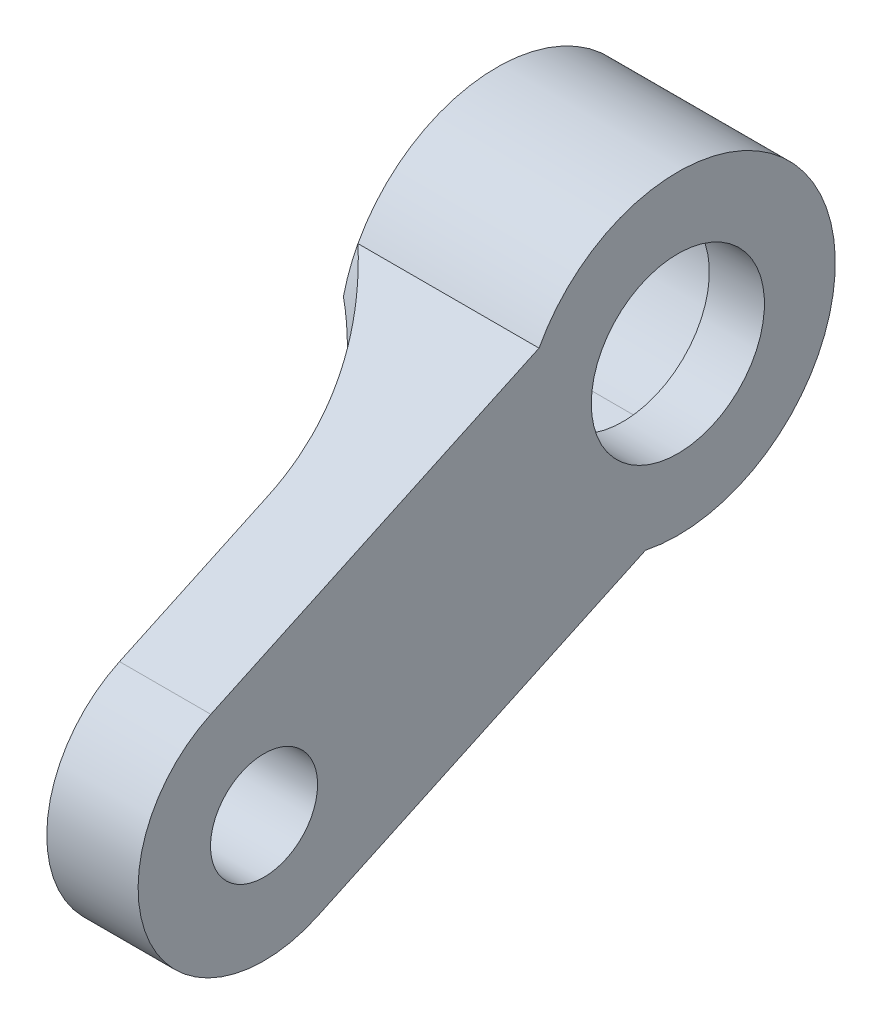
ISO-10303-21;
HEADER;
FILE_DESCRIPTION(('STEP AP214'),'2;1');
FILE_NAME('part.step','',(''),(''),'','','');
FILE_SCHEMA(('AUTOMOTIVE_DESIGN { 1 0 10303 214 1 1 1 1 }'));
ENDSEC;
DATA;
#1=APPLICATION_CONTEXT('core data for automotive mechanical design processes');
#2=APPLICATION_PROTOCOL_DEFINITION('international standard','automotive_design',2000,#1);
#3=PRODUCT_CONTEXT('',#1,'mechanical');
#4=PRODUCT('Part','Part','',(#3));
#5=PRODUCT_RELATED_PRODUCT_CATEGORY('part','',(#4));
#6=PRODUCT_DEFINITION_FORMATION('','',#4);
#7=PRODUCT_DEFINITION_CONTEXT('part definition',#1,'design');
#8=PRODUCT_DEFINITION('design','',#6,#7);
#9=PRODUCT_DEFINITION_SHAPE('','',#8);
#10=(LENGTH_UNIT() NAMED_UNIT(*) SI_UNIT(.MILLI.,.METRE.));
#11=(NAMED_UNIT(*) PLANE_ANGLE_UNIT() SI_UNIT($,.RADIAN.));
#12=(NAMED_UNIT(*) SI_UNIT($,.STERADIAN.) SOLID_ANGLE_UNIT());
#13=UNCERTAINTY_MEASURE_WITH_UNIT(LENGTH_MEASURE(1.E-05),#10,'distance_accuracy_value','');
#14=(GEOMETRIC_REPRESENTATION_CONTEXT(3) GLOBAL_UNCERTAINTY_ASSIGNED_CONTEXT((#13)) GLOBAL_UNIT_ASSIGNED_CONTEXT((#10,
#11,#12)) REPRESENTATION_CONTEXT('',''));
#15=CARTESIAN_POINT('',(0.,0.,0.));
#16=DIRECTION('',(0.,0.,1.));
#17=DIRECTION('',(1.,0.,0.));
#18=AXIS2_PLACEMENT_3D('',#15,#16,#17);
#19=CARTESIAN_POINT('',(41.15,-19.3632656734985,-42.4024999550802));
#20=DIRECTION('',(-1.,0.,0.));
#21=DIRECTION('',(0.,0.,1.));
#22=AXIS2_PLACEMENT_3D('',#19,#20,#21);
#23=CYLINDRICAL_SURFACE('',#22,2.75000000000001);
#24=CARTESIAN_POINT('',(46.9,-19.3632656734985,-42.4024999550802));
#25=DIRECTION('',(-1.,0.,0.));
#26=DIRECTION('',(0.,0.,1.));
#27=AXIS2_PLACEMENT_3D('',#24,#25,#26);
#28=CIRCLE('',#27,2.75000000000001);
#29=CARTESIAN_POINT('',(46.9,-19.3632656734985,-39.6524999550802));
#30=VERTEX_POINT('',#29);
#31=EDGE_CURVE('E175',#30,#30,#28,.T.);
#32=ORIENTED_EDGE('',*,*,#31,.F.);
#33=EDGE_LOOP('',(#32));
#34=FACE_BOUND('',#33,.T.);
#35=CARTESIAN_POINT('',(45.15,-19.3632656734985,-42.4024999550802));
#36=DIRECTION('',(-1.,0.,0.));
#37=DIRECTION('',(0.,0.,1.));
#38=AXIS2_PLACEMENT_3D('',#35,#36,#37);
#39=CIRCLE('',#38,2.75000000000001);
#40=CARTESIAN_POINT('',(45.15,-19.3632656734985,-39.6524999550802));
#41=VERTEX_POINT('',#40);
#42=EDGE_CURVE('E50',#41,#41,#39,.F.);
#43=ORIENTED_EDGE('',*,*,#42,.F.);
#44=EDGE_LOOP('',(#43));
#45=FACE_BOUND('',#44,.T.);
#46=ADVANCED_FACE('F45',(#34,#45),#23,.F.);
#47=CARTESIAN_POINT('',(44.,-19.3632656734985,-42.4024999550802));
#48=DIRECTION('',(-1.,0.,0.));
#49=DIRECTION('',(0.,0.,1.));
#50=AXIS2_PLACEMENT_3D('',#47,#48,#49);
#51=CYLINDRICAL_SURFACE('',#50,5.);
#52=CARTESIAN_POINT('',(41.15,-19.3632656734985,-42.4024999550802));
#53=DIRECTION('',(-1.,0.,0.));
#54=DIRECTION('',(0.,0.,1.));
#55=AXIS2_PLACEMENT_3D('',#52,#53,#54);
#56=CIRCLE('',#55,5.);
#57=CARTESIAN_POINT('',(41.15,-17.005889310574,-37.9931035470075));
#58=VERTEX_POINT('',#57);
#59=CARTESIAN_POINT('',(41.15,-24.2563516068672,-41.3740496409331));
#60=VERTEX_POINT('',#59);
#61=EDGE_CURVE('E228',#58,#60,#56,.T.);
#62=ORIENTED_EDGE('',*,*,#61,.F.);
#63=DIRECTION('',(-1.,0.,0.));
#64=VECTOR('',#63,1.);
#65=CARTESIAN_POINT('',(61.0421356237309,-17.005889310574,-37.9931035470075));
#66=LINE('',#65,#64);
#67=CARTESIAN_POINT('',(46.9,-17.005889310574,-37.9931035470075));
#68=VERTEX_POINT('',#67);
#69=EDGE_CURVE('E190',#68,#58,#66,.T.);
#70=ORIENTED_EDGE('',*,*,#69,.F.);
#71=CARTESIAN_POINT('',(46.9,-19.3632656734985,-42.4024999550802));
#72=DIRECTION('',(-1.,0.,0.));
#73=DIRECTION('',(0.,0.,1.));
#74=AXIS2_PLACEMENT_3D('',#71,#72,#73);
#75=CIRCLE('',#74,5.);
#76=CARTESIAN_POINT('',(46.9,-24.2563516068672,-41.3740496409331));
#77=VERTEX_POINT('',#76);
#78=EDGE_CURVE('E187',#77,#68,#75,.F.);
#79=ORIENTED_EDGE('',*,*,#78,.F.);
#80=DIRECTION('',(-1.,0.,0.));
#81=VECTOR('',#80,1.);
#82=CARTESIAN_POINT('',(61.0421356237309,-24.2563516068672,-41.3740496409331));
#83=LINE('',#82,#81);
#84=EDGE_CURVE('E193',#60,#77,#83,.F.);
#85=ORIENTED_EDGE('',*,*,#84,.F.);
#86=EDGE_LOOP('',(#62,#70,#79,#85));
#87=FACE_BOUND('',#86,.T.);
#88=ADVANCED_FACE('F268',(#87),#51,.T.);
#89=CARTESIAN_POINT('',(41.15,-19.3632656734985,-42.4024999550802));
#90=DIRECTION('',(-1.,0.,0.));
#91=DIRECTION('',(0.,0.,1.));
#92=AXIS2_PLACEMENT_3D('',#89,#90,#91);
#93=PLANE('',#92);
#94=DIRECTION('',(0.,0.544502263470201,-0.838759372571077));
#95=VECTOR('',#94,1.);
#96=CARTESIAN_POINT('',(41.15,-16.3437319322427,-40.4422918065875));
#97=LINE('',#96,#95);
#98=CARTESIAN_POINT('',(41.15,-18.2330841724793,-37.5319055586278));
#99=VERTEX_POINT('',#98);
#100=CARTESIAN_POINT('',(41.15,-16.3437319322427,-40.4422918065875));
#101=VERTEX_POINT('',#100);
#102=EDGE_CURVE('E153',#99,#101,#97,.T.);
#103=ORIENTED_EDGE('',*,*,#102,.F.);
#104=EDGE_CURVE('E227',#99,#58,#56,.T.);
#105=ORIENTED_EDGE('',*,*,#104,.T.);
#106=ORIENTED_EDGE('',*,*,#61,.T.);
#107=CARTESIAN_POINT('',(41.15,-23.8208241111395,-40.1375114838036));
#108=VERTEX_POINT('',#107);
#109=EDGE_CURVE('E233',#60,#108,#56,.T.);
#110=ORIENTED_EDGE('',*,*,#109,.T.);
#111=DIRECTION('',(0.,-0.29252764806711,0.956257065394199));
#112=VECTOR('',#111,1.);
#113=CARTESIAN_POINT('',(41.15,-25.2574450657046,-35.4412752573354));
#114=LINE('',#113,#112);
#115=CARTESIAN_POINT('',(41.15,-22.8057911089176,-43.4555994881218));
#116=VERTEX_POINT('',#115);
#117=EDGE_CURVE('E63',#116,#108,#114,.T.);
#118=ORIENTED_EDGE('',*,*,#117,.F.);
#119=CARTESIAN_POINT('',(41.15,-19.3632656734985,-42.4024999550802));
#120=DIRECTION('',(-1.,0.,0.));
#121=DIRECTION('',(0.,0.,1.));
#122=AXIS2_PLACEMENT_3D('',#119,#120,#121);
#123=CIRCLE('',#122,3.59999999999999);
#124=EDGE_CURVE('E134',#101,#116,#123,.T.);
#125=ORIENTED_EDGE('',*,*,#124,.F.);
#126=EDGE_LOOP('',(#103,#105,#106,#110,#118,#125));
#127=FACE_BOUND('',#126,.T.);
#128=ADVANCED_FACE('F266',(#127),#93,.T.);
#129=CARTESIAN_POINT('',(44.,-25.4912304687386,-29.2610370430488));
#130=DIRECTION('',(-1.,0.,0.));
#131=DIRECTION('',(0.,0.,1.));
#132=AXIS2_PLACEMENT_3D('',#129,#130,#131);
#133=PLANE('',#132);
#134=CARTESIAN_POINT('',(44.,-25.4912304687386,-29.2610370430488));
#135=DIRECTION('',(-1.,0.,0.));
#136=DIRECTION('',(0.,0.,1.));
#137=AXIS2_PLACEMENT_3D('',#134,#135,#136);
#138=CIRCLE('',#137,1.70000000000001);
#139=CARTESIAN_POINT('',(44.,-25.4912304687386,-27.5610370430488));
#140=VERTEX_POINT('',#139);
#141=EDGE_CURVE('E183',#140,#140,#138,.T.);
#142=ORIENTED_EDGE('',*,*,#141,.F.);
#143=EDGE_LOOP('',(#142));
#144=FACE_BOUND('',#143,.T.);
#145=DIRECTION('',(0.,-0.422618261740703,0.906307787036648));
#146=VECTOR('',#145,1.);
#147=CARTESIAN_POINT('',(44.,-21.8659993205921,-27.570563996086));
#148=LINE('',#147,#146);
#149=CARTESIAN_POINT('',(44.,-19.6605065307051,-32.3002585471325));
#150=VERTEX_POINT('',#149);
#151=CARTESIAN_POINT('',(44.,-21.8659993205921,-27.570563996086));
#152=VERTEX_POINT('',#151);
#153=EDGE_CURVE('E203',#150,#152,#148,.T.);
#154=ORIENTED_EDGE('',*,*,#153,.F.);
#155=CARTESIAN_POINT('',(44.,-19.3632656734985,-42.4024999550802));
#156=DIRECTION('',(-1.,0.,0.));
#157=DIRECTION('',(0.,0.,1.));
#158=AXIS2_PLACEMENT_3D('',#155,#156,#157);
#159=CIRCLE('',#158,10.1066133591648);
#160=CARTESIAN_POINT('',(44.,-26.9109688269983,-35.681204641058));
#161=VERTEX_POINT('',#160);
#162=EDGE_CURVE('E232',#150,#161,#159,.F.);
#163=ORIENTED_EDGE('',*,*,#162,.T.);
#164=DIRECTION('',(0.,0.422618261740692,-0.906307787036653));
#165=VECTOR('',#164,1.);
#166=CARTESIAN_POINT('',(44.,-22.9884968216452,-44.092973002043));
#167=LINE('',#166,#165);
#168=CARTESIAN_POINT('',(44.,-29.1164616168852,-30.9515100900116));
#169=VERTEX_POINT('',#168);
#170=EDGE_CURVE('E214',#169,#161,#167,.T.);
#171=ORIENTED_EDGE('',*,*,#170,.F.);
#172=CARTESIAN_POINT('',(44.,-25.4912304687386,-29.2610370430488));
#173=DIRECTION('',(1.,0.,0.));
#174=DIRECTION('',(0.,0.,1.));
#175=AXIS2_PLACEMENT_3D('',#172,#173,#174);
#176=CIRCLE('',#175,3.99999999999996);
#177=EDGE_CURVE('E197',#152,#169,#176,.T.);
#178=ORIENTED_EDGE('',*,*,#177,.F.);
#179=EDGE_LOOP('',(#154,#163,#171,#178));
#180=FACE_BOUND('',#179,.T.);
#181=ADVANCED_FACE('F256',(#144,#180),#133,.T.);
#182=CARTESIAN_POINT('',(46.9,-25.4912304687386,-29.2610370430488));
#183=DIRECTION('',(-1.,0.,0.));
#184=DIRECTION('',(0.,0.,1.));
#185=AXIS2_PLACEMENT_3D('',#182,#183,#184);
#186=CYLINDRICAL_SURFACE('',#185,3.99999999999996);
#187=ORIENTED_EDGE('',*,*,#177,.T.);
#188=DIRECTION('',(-1.,0.,0.));
#189=VECTOR('',#188,1.);
#190=CARTESIAN_POINT('',(46.9,-29.1164616168852,-30.9515100900116));
#191=LINE('',#190,#189);
#192=CARTESIAN_POINT('',(46.9,-29.1164616168852,-30.9515100900116));
#193=VERTEX_POINT('',#192);
#194=EDGE_CURVE('E223',#193,#169,#191,.T.);
#195=ORIENTED_EDGE('',*,*,#194,.F.);
#196=CARTESIAN_POINT('',(46.9,-25.4912304687386,-29.2610370430488));
#197=DIRECTION('',(1.,0.,0.));
#198=DIRECTION('',(0.,0.,1.));
#199=AXIS2_PLACEMENT_3D('',#196,#197,#198);
#200=CIRCLE('',#199,3.99999999999996);
#201=CARTESIAN_POINT('',(46.9,-21.8659993205921,-27.570563996086));
#202=VERTEX_POINT('',#201);
#203=EDGE_CURVE('E198',#202,#193,#200,.T.);
#204=ORIENTED_EDGE('',*,*,#203,.F.);
#205=DIRECTION('',(-1.,0.,0.));
#206=VECTOR('',#205,1.);
#207=CARTESIAN_POINT('',(46.9,-21.8659993205921,-27.570563996086));
#208=LINE('',#207,#206);
#209=EDGE_CURVE('E210',#202,#152,#208,.T.);
#210=ORIENTED_EDGE('',*,*,#209,.T.);
#211=EDGE_LOOP('',(#187,#195,#204,#210));
#212=FACE_BOUND('',#211,.T.);
#213=ADVANCED_FACE('F261',(#212),#186,.T.);
#214=CARTESIAN_POINT('',(46.9,-22.9884968216452,-44.092973002043));
#215=DIRECTION('',(0.,0.906307787036653,0.422618261740692));
#216=DIRECTION('',(0.,-0.422618261740692,0.906307787036653));
#217=AXIS2_PLACEMENT_3D('',#214,#215,#216);
#218=PLANE('',#217);
#219=ORIENTED_EDGE('',*,*,#170,.T.);
#220=CARTESIAN_POINT('',(44.,-26.9109688269983,-35.681204641058));
#221=CARTESIAN_POINT('',(44.0000327295333,-26.8197614564599,-35.8767994783791));
#222=CARTESIAN_POINT('',(43.9901832031741,-26.7285848499537,-36.0723283420203));
#223=CARTESIAN_POINT('',(43.9516322511718,-26.5470314890996,-36.4616707808138));
#224=CARTESIAN_POINT('',(43.9229492677209,-26.4566540398497,-36.6554858461881));
#225=CARTESIAN_POINT('',(43.8479501167086,-26.2779938184975,-37.0386239272976));
#226=CARTESIAN_POINT('',(43.8017808468564,-26.1896999343085,-37.2279707729796));
#227=CARTESIAN_POINT('',(43.6928417332647,-26.0149440385046,-37.6027360009309));
#228=CARTESIAN_POINT('',(43.6300668020894,-25.9284825970739,-37.7881531604364));
#229=CARTESIAN_POINT('',(43.4726881628036,-25.7380286945601,-38.1965828724152));
#230=CARTESIAN_POINT('',(43.3740786102851,-25.6346258097312,-38.4183310745315));
#231=CARTESIAN_POINT('',(43.1556871669465,-25.4318964419442,-38.8530856067413));
#232=CARTESIAN_POINT('',(43.035900404997,-25.3325709033379,-39.0660899116657));
#233=CARTESIAN_POINT('',(42.7771330317672,-25.1381100186839,-39.4831126245748));
#234=CARTESIAN_POINT('',(42.6380945934448,-25.042988480697,-39.6871014210771));
#235=CARTESIAN_POINT('',(42.3434140225703,-24.8574498923156,-40.0849902078826));
#236=CARTESIAN_POINT('',(42.1877688543027,-24.7670337065706,-40.278888343939));
#237=CARTESIAN_POINT('',(41.8881075874565,-24.6050274297746,-40.626311925694));
#238=CARTESIAN_POINT('',(41.746199499198,-24.5327356290325,-40.7813421926814));
#239=CARTESIAN_POINT('',(41.454138478049,-24.3918790803988,-41.0834100360255));
#240=CARTESIAN_POINT('',(41.3040345001586,-24.3232962257215,-41.2304864425093));
#241=CARTESIAN_POINT('',(41.15,-24.2563516068672,-41.3740496409331));
#242=B_SPLINE_CURVE_WITH_KNOTS('',3,(#220,#221,#222,#223,#224,#225,#226,#227,#228,#229,#230,
#231,#232,#233,#234,#235,#236,#237,#238,#239,#240,#241),.UNSPECIFIED.,.F.,.F.,(4,2,2,2,2,2,2,2,
2,2,4),(0.,0.647112947909194,1.29359316975926,1.93475879312719,2.57612107679734,
3.36636659999365,4.15679413057498,4.94964959702112,5.74265024681657,6.4091006805164,
7.07193219657398),.UNSPECIFIED.);
#243=EDGE_CURVE('E243',#161,#60,#242,.T.);
#244=ORIENTED_EDGE('',*,*,#243,.T.);
#245=ORIENTED_EDGE('',*,*,#84,.T.);
#246=DIRECTION('',(0.,0.422618261740692,-0.906307787036653));
#247=VECTOR('',#246,1.);
#248=CARTESIAN_POINT('',(46.9,-22.9884968216452,-44.092973002043));
#249=LINE('',#248,#247);
#250=EDGE_CURVE('E202',#193,#77,#249,.T.);
#251=ORIENTED_EDGE('',*,*,#250,.F.);
#252=ORIENTED_EDGE('',*,*,#194,.T.);
#253=EDGE_LOOP('',(#219,#244,#245,#251,#252));
#254=FACE_BOUND('',#253,.T.);
#255=ADVANCED_FACE('F255',(#254),#218,.F.);
#256=CARTESIAN_POINT('',(46.9,-21.8659993205921,-27.570563996086));
#257=DIRECTION('',(0.,-0.906307787036648,-0.422618261740703));
#258=DIRECTION('',(0.,0.422618261740703,-0.906307787036648));
#259=AXIS2_PLACEMENT_3D('',#256,#257,#258);
#260=PLANE('',#259);
#261=DIRECTION('',(0.,-0.422618261740703,0.906307787036648));
#262=VECTOR('',#261,1.);
#263=CARTESIAN_POINT('',(46.9,-21.8659993205921,-27.570563996086));
#264=LINE('',#263,#262);
#265=EDGE_CURVE('E207',#68,#202,#264,.T.);
#266=ORIENTED_EDGE('',*,*,#265,.F.);
#267=ORIENTED_EDGE('',*,*,#69,.T.);
#268=CARTESIAN_POINT('',(41.15,-17.005889310574,-37.9931035470075));
#269=CARTESIAN_POINT('',(41.3418738388692,-17.089288889543,-37.814252572741));
#270=CARTESIAN_POINT('',(41.5277079199327,-17.1752454595924,-37.6299181134067));
#271=CARTESIAN_POINT('',(41.8853864283286,-17.3524537915975,-37.2498936190498));
#272=CARTESIAN_POINT('',(42.0572062740653,-17.4437143966062,-37.0541846200388));
#273=CARTESIAN_POINT('',(42.3859658197307,-17.6323980164965,-36.6495512913972));
#274=CARTESIAN_POINT('',(42.5427329207076,-17.7298750788148,-36.4405110566647));
#275=CARTESIAN_POINT('',(42.8365631154949,-17.929936880589,-36.0114771382302));
#276=CARTESIAN_POINT('',(42.973639827842,-18.0325180231324,-35.7914911681322));
#277=CARTESIAN_POINT('',(43.2014188319922,-18.2224584780283,-35.3841625481232));
#278=CARTESIAN_POINT('',(43.2959802338015,-18.3089921319281,-35.1985905284781));
#279=CARTESIAN_POINT('',(43.4689778739043,-18.4848861052588,-34.8213846853945));
#280=CARTESIAN_POINT('',(43.5474176089507,-18.5742458068643,-34.6297521868868));
#281=CARTESIAN_POINT('',(43.6864004185754,-18.7548967517852,-34.2423449853074));
#282=CARTESIAN_POINT('',(43.7470370306641,-18.8461750976408,-34.0465979409273));
#283=CARTESIAN_POINT('',(43.8496522841153,-19.0305521984741,-33.6511999722068));
#284=CARTESIAN_POINT('',(43.8916407858761,-19.1236499641592,-33.4515511694111));
#285=CARTESIAN_POINT('',(43.9488492945265,-19.2906346296926,-33.093451398556));
#286=CARTESIAN_POINT('',(43.9679078503326,-19.3642889578016,-32.9354991822006));
#287=CARTESIAN_POINT('',(43.9935013448059,-19.512124120854,-32.6184656519401));
#288=CARTESIAN_POINT('',(44.0000123974606,-19.5863056907054,-32.4593827620196));
#289=CARTESIAN_POINT('',(44.,-19.6605065307051,-32.3002585471325));
#290=B_SPLINE_CURVE_WITH_KNOTS('',3,(#268,#269,#270,#271,#272,#273,#274,#275,#276,#277,#278,
#279,#280,#281,#282,#283,#284,#285,#286,#287,#288,#289),.UNSPECIFIED.,.F.,.F.,(4,2,2,2,2,2,2,2,
2,2,4),(0.,0.825787813876534,1.65299426781315,2.48877054858107,3.32396596593583,3.9999614355401,
4.67581012817157,5.34804162297307,6.01991724337438,6.54544467643874,7.07197154363121),.UNSPECIFIED.);
#291=EDGE_CURVE('E71',#58,#150,#290,.T.);
#292=ORIENTED_EDGE('',*,*,#291,.T.);
#293=ORIENTED_EDGE('',*,*,#153,.T.);
#294=ORIENTED_EDGE('',*,*,#209,.F.);
#295=EDGE_LOOP('',(#266,#267,#292,#293,#294));
#296=FACE_BOUND('',#295,.T.);
#297=ADVANCED_FACE('F250',(#296),#260,.F.);
#298=CARTESIAN_POINT('',(46.9,-25.4912304687386,-29.2610370430488));
#299=DIRECTION('',(-1.,0.,0.));
#300=DIRECTION('',(0.,0.,1.));
#301=AXIS2_PLACEMENT_3D('',#298,#299,#300);
#302=PLANE('',#301);
#303=ORIENTED_EDGE('',*,*,#31,.T.);
#304=EDGE_LOOP('',(#303));
#305=FACE_BOUND('',#304,.T.);
#306=CARTESIAN_POINT('',(46.9,-25.4912304687386,-29.2610370430488));
#307=DIRECTION('',(1.,0.,0.));
#308=DIRECTION('',(0.,0.,-1.));
#309=AXIS2_PLACEMENT_3D('',#306,#307,#308);
#310=CIRCLE('',#309,1.70000000000001);
#311=CARTESIAN_POINT('',(46.9,-25.4912304687386,-30.9610370430488));
#312=VERTEX_POINT('',#311);
#313=EDGE_CURVE('E179',#312,#312,#310,.T.);
#314=ORIENTED_EDGE('',*,*,#313,.F.);
#315=EDGE_LOOP('',(#314));
#316=FACE_BOUND('',#315,.T.);
#317=ORIENTED_EDGE('',*,*,#250,.T.);
#318=ORIENTED_EDGE('',*,*,#78,.T.);
#319=ORIENTED_EDGE('',*,*,#265,.T.);
#320=ORIENTED_EDGE('',*,*,#203,.T.);
#321=EDGE_LOOP('',(#317,#318,#319,#320));
#322=FACE_BOUND('',#321,.T.);
#323=ADVANCED_FACE('F254',(#305,#316,#322),#302,.F.);
#324=CARTESIAN_POINT('',(46.9,-25.4912304687386,-29.2610370430488));
#325=DIRECTION('',(1.,0.,0.));
#326=DIRECTION('',(0.,0.,-1.));
#327=AXIS2_PLACEMENT_3D('',#324,#325,#326);
#328=CYLINDRICAL_SURFACE('',#327,1.70000000000001);
#329=ORIENTED_EDGE('',*,*,#141,.T.);
#330=EDGE_LOOP('',(#329));
#331=FACE_BOUND('',#330,.T.);
#332=ORIENTED_EDGE('',*,*,#313,.T.);
#333=EDGE_LOOP('',(#332));
#334=FACE_BOUND('',#333,.T.);
#335=ADVANCED_FACE('F306',(#331,#334),#328,.F.);
#336=CARTESIAN_POINT('',(38.,-19.3632656734985,-42.4024999550802));
#337=DIRECTION('',(-1.,0.,0.));
#338=DIRECTION('',(0.,0.,1.));
#339=AXIS2_PLACEMENT_3D('',#336,#337,#338);
#340=TOROIDAL_SURFACE('',#339,10.1066133591648,6.);
#341=ORIENTED_EDGE('',*,*,#104,.F.);
#342=CARTESIAN_POINT('',(41.1498,-18.2329873779623,-37.5320546623391));
#343=CARTESIAN_POINT('',(41.2464839261362,-18.2797891256925,-37.4599605551242));
#344=CARTESIAN_POINT('',(41.3412934103873,-18.3277349379726,-37.386104113887));
#345=CARTESIAN_POINT('',(41.5270475735878,-18.4257984248656,-37.235045662423));
#346=CARTESIAN_POINT('',(41.6179922157307,-18.4759161201531,-37.1578436203486));
#347=CARTESIAN_POINT('',(41.7959528293461,-18.5782372022139,-37.0002267060622));
#348=CARTESIAN_POINT('',(41.8829663868282,-18.63044183442,-36.9198099153671));
#349=CARTESIAN_POINT('',(42.0528293737482,-18.7368160877908,-36.7559494358047));
#350=CARTESIAN_POINT('',(42.1356788233212,-18.790985699452,-36.6725057615768));
#351=CARTESIAN_POINT('',(42.3727555081741,-18.952952203944,-36.4230101528359));
#352=CARTESIAN_POINT('',(42.5210114887081,-19.0633741024345,-36.2529146206233));
#353=CARTESIAN_POINT('',(42.7994720756425,-19.2907345128554,-35.9026852680825));
#354=CARTESIAN_POINT('',(42.9296810908752,-19.407671423362,-35.7225539146115));
#355=CARTESIAN_POINT('',(43.1560742280765,-19.633301550723,-35.3749899157912));
#356=CARTESIAN_POINT('',(43.2544602104874,-19.7413395675751,-35.2085665502551));
#357=CARTESIAN_POINT('',(43.4345128932482,-19.9614497545666,-34.8695055495517));
#358=CARTESIAN_POINT('',(43.5161837728982,-20.0735209080349,-34.6968694804796));
#359=CARTESIAN_POINT('',(43.6635798850373,-20.3042111840536,-34.3415107535231));
#360=CARTESIAN_POINT('',(43.7288048453555,-20.4229256220054,-34.1586412703789));
#361=CARTESIAN_POINT('',(43.8391387091365,-20.6632121511778,-33.788500332559));
#362=CARTESIAN_POINT('',(43.8842277019096,-20.7847869462955,-33.6012247127601));
#363=CARTESIAN_POINT('',(43.9185972147815,-20.9072975230833,-33.4125076009798));
#364=B_SPLINE_CURVE_WITH_KNOTS('',3,(#342,#343,#344,#345,#346,#347,#348,#349,#350,#351,#352,
#353,#354,#355,#356,#357,#358,#359,#360,#361,#362,#363),.UNSPECIFIED.,.F.,.F.,(4,2,2,2,2,2,2,2,
2,2,4),(0.,0.388061692675894,0.776127080202238,1.16442761786467,1.55272627777069,
2.30538313734996,3.05785579926119,3.72154732916275,4.38507271207976,5.06684514922705,
5.74929024661289),.UNSPECIFIED.);
#365=CARTESIAN_POINT('',(43.9185607488582,-20.9071676879287,-33.41270760098));
#366=VERTEX_POINT('',#365);
#367=EDGE_CURVE('E11',#99,#366,#364,.T.);
#368=ORIENTED_EDGE('',*,*,#367,.T.);
#369=CARTESIAN_POINT('',(43.918570414306,-20.9069676879287,-33.4126143394484));
#370=CARTESIAN_POINT('',(43.9097724481628,-21.0881944695322,-33.4971217755729));
#371=CARTESIAN_POINT('',(43.9013469077062,-21.2694423879283,-33.5816390679456));
#372=CARTESIAN_POINT('',(43.8860730126615,-21.6320115606428,-33.7507078497933));
#373=CARTESIAN_POINT('',(43.8792248297953,-21.8133328207952,-33.8352593419887));
#374=CARTESIAN_POINT('',(43.867944185883,-22.1759141771946,-34.004333805182));
#375=CARTESIAN_POINT('',(43.863510048081,-22.3571742282776,-34.0888567551196));
#376=CARTESIAN_POINT('',(43.8575391233077,-22.7197249799696,-34.2579169471034));
#377=CARTESIAN_POINT('',(43.8560021797865,-22.9010156783931,-34.3424541881305));
#378=CARTESIAN_POINT('',(43.8560021797865,-23.2635970752402,-34.5115286701849));
#379=CARTESIAN_POINT('',(43.8575391233077,-23.4448877736637,-34.596065911212));
#380=CARTESIAN_POINT('',(43.863510048081,-23.8074385253557,-34.7651261031958));
#381=CARTESIAN_POINT('',(43.867944185883,-23.9886985764387,-34.8496490531334));
#382=CARTESIAN_POINT('',(43.8792248297953,-24.3512799328382,-35.0187235163267));
#383=CARTESIAN_POINT('',(43.8860730126615,-24.5326011929906,-35.1032750085221));
#384=CARTESIAN_POINT('',(43.9013469077062,-24.8951703657051,-35.2723437903698));
#385=CARTESIAN_POINT('',(43.9097724481628,-25.0764182841011,-35.3568610827425));
#386=CARTESIAN_POINT('',(43.918570414306,-25.2576450657046,-35.441368518867));
#387=B_SPLINE_CURVE_WITH_KNOTS('',3,(#369,#370,#371,#372,#373,#374,#375,#376,#377,#378,#379,
#380,#381,#382,#383,#384,#385,#386),.UNSPECIFIED.,.F.,.F.,(4,2,2,2,2,2,2,2,4),(0.,
0.600475937890758,1.20101721684903,1.8011408358355,2.40123202619402,3.00132321655254,
3.60144683553901,4.20198811449728,4.80246405238803),.UNSPECIFIED.);
#388=CARTESIAN_POINT('',(43.9185607488582,-25.2574450657046,-35.4412752573354));
#389=VERTEX_POINT('',#388);
#390=EDGE_CURVE('E56',#366,#389,#387,.T.);
#391=ORIENTED_EDGE('',*,*,#390,.T.);
#392=CARTESIAN_POINT('',(43.9185927345629,-25.2575062475058,-35.4410752573354));
#393=CARTESIAN_POINT('',(43.8891724476792,-25.2011888898709,-35.6251736545244));
#394=CARTESIAN_POINT('',(43.8519133303101,-25.1452349423301,-35.8080840837646));
#395=CARTESIAN_POINT('',(43.7624951171737,-25.034387499092,-36.1704383825045));
#396=CARTESIAN_POINT('',(43.710344652259,-24.9794934087324,-36.3498841959226));
#397=CARTESIAN_POINT('',(43.5920220153075,-24.8711583207931,-36.7040257410264));
#398=CARTESIAN_POINT('',(43.5258824025109,-24.8177142686751,-36.8787314578324));
#399=CARTESIAN_POINT('',(43.3803308596362,-24.7123904528918,-37.2230293170691));
#400=CARTESIAN_POINT('',(43.3009168251118,-24.6605109388007,-37.3926206436554));
#401=CARTESIAN_POINT('',(43.1208821241408,-24.5533003013696,-37.7430864208438));
#402=CARTESIAN_POINT('',(43.0189212569164,-24.498161713247,-37.9233314842299));
#403=CARTESIAN_POINT('',(42.8010577787471,-24.3902922792557,-38.2759508317544));
#404=CARTESIAN_POINT('',(42.6851535604711,-24.3375617119418,-38.4483242053117));
#405=CARTESIAN_POINT('',(42.4405127619536,-24.2347095008144,-38.784542522561));
#406=CARTESIAN_POINT('',(42.3117748149713,-24.1845881357374,-38.948386555078));
#407=CARTESIAN_POINT('',(42.0425196971629,-24.0871569637267,-39.2668837885552));
#408=CARTESIAN_POINT('',(41.9020065948156,-24.0398461952692,-39.421540132684));
#409=CARTESIAN_POINT('',(41.6595540636445,-23.9637684494629,-39.6702341704177));
#410=CARTESIAN_POINT('',(41.5606984801735,-23.9341550917375,-39.7670386357121));
#411=CARTESIAN_POINT('',(41.3585671851352,-23.8763775961905,-39.9559101447904));
#412=CARTESIAN_POINT('',(41.2553013012198,-23.8482105156481,-40.0479868081697));
#413=CARTESIAN_POINT('',(41.1498,-23.8207721093861,-40.1376814747236));
#414=B_SPLINE_CURVE_WITH_KNOTS('',3,(#392,#393,#394,#395,#396,#397,#398,#399,#400,#401,#402,
#403,#404,#405,#406,#407,#408,#409,#410,#411,#412,#413),.UNSPECIFIED.,.F.,.F.,(4,2,2,2,2,2,2,2,
2,2,4),(0.,0.584039906762632,1.1677419954602,1.750100200819,2.33255081742852,2.97480514033486,
3.61713357070082,4.25953047970073,4.90170633967792,5.32604404084718,5.74948103395814),.UNSPECIFIED.);
#415=EDGE_CURVE('E289',#389,#108,#414,.T.);
#416=ORIENTED_EDGE('',*,*,#415,.T.);
#417=ORIENTED_EDGE('',*,*,#109,.F.);
#418=ORIENTED_EDGE('',*,*,#243,.F.);
#419=ORIENTED_EDGE('',*,*,#162,.F.);
#420=ORIENTED_EDGE('',*,*,#291,.F.);
#421=EDGE_LOOP('',(#341,#368,#391,#416,#417,#418,#419,#420));
#422=FACE_BOUND('',#421,.T.);
#423=ADVANCED_FACE('F47',(#422),#340,.F.);
#424=CARTESIAN_POINT('',(45.15,-19.3632656734985,-42.4024999550802));
#425=DIRECTION('',(-1.,0.,0.));
#426=DIRECTION('',(0.,0.,1.));
#427=AXIS2_PLACEMENT_3D('',#424,#425,#426);
#428=PLANE('',#427);
#429=CARTESIAN_POINT('',(45.15,-19.3632656734985,-42.4024999550802));
#430=DIRECTION('',(-1.,0.,0.));
#431=DIRECTION('',(0.,0.,1.));
#432=AXIS2_PLACEMENT_3D('',#429,#430,#431);
#433=CIRCLE('',#432,3.59999999999999);
#434=CARTESIAN_POINT('',(45.15,-16.3437319322427,-40.4422918065875));
#435=VERTEX_POINT('',#434);
#436=CARTESIAN_POINT('',(45.15,-22.8057911089176,-43.4555994881218));
#437=VERTEX_POINT('',#436);
#438=EDGE_CURVE('E131',#435,#437,#433,.T.);
#439=ORIENTED_EDGE('',*,*,#438,.T.);
#440=DIRECTION('',(0.,-0.29252764806711,0.956257065394199));
#441=VECTOR('',#440,1.);
#442=CARTESIAN_POINT('',(45.15,-25.2574450657046,-35.4412752573354));
#443=LINE('',#442,#441);
#444=CARTESIAN_POINT('',(45.15,-25.2574450657046,-35.4412752573354));
#445=VERTEX_POINT('',#444);
#446=EDGE_CURVE('E140',#437,#445,#443,.T.);
#447=ORIENTED_EDGE('',*,*,#446,.T.);
#448=DIRECTION('',(0.,0.906307787036651,0.422618261740697));
#449=VECTOR('',#448,1.);
#450=CARTESIAN_POINT('',(45.15,-20.9071676879287,-33.41270760098));
#451=LINE('',#450,#449);
#452=CARTESIAN_POINT('',(45.15,-20.9071676879287,-33.41270760098));
#453=VERTEX_POINT('',#452);
#454=EDGE_CURVE('E147',#445,#453,#451,.T.);
#455=ORIENTED_EDGE('',*,*,#454,.T.);
#456=DIRECTION('',(0.,0.544502263470201,-0.838759372571077));
#457=VECTOR('',#456,1.);
#458=CARTESIAN_POINT('',(45.15,-16.3437319322427,-40.4422918065875));
#459=LINE('',#458,#457);
#460=EDGE_CURVE('E137',#453,#435,#459,.T.);
#461=ORIENTED_EDGE('',*,*,#460,.T.);
#462=EDGE_LOOP('',(#439,#447,#455,#461));
#463=FACE_BOUND('',#462,.T.);
#464=ORIENTED_EDGE('',*,*,#42,.T.);
#465=EDGE_LOOP('',(#464));
#466=FACE_BOUND('',#465,.T.);
#467=ADVANCED_FACE('F149',(#463,#466),#428,.T.);
#468=CARTESIAN_POINT('',(45.15,-16.3437319322427,-40.4422918065875));
#469=DIRECTION('',(0.,0.838759372571077,0.544502263470201));
#470=DIRECTION('',(0.,-0.544502263470201,0.838759372571077));
#471=AXIS2_PLACEMENT_3D('',#468,#469,#470);
#472=PLANE('',#471);
#473=ORIENTED_EDGE('',*,*,#102,.T.);
#474=DIRECTION('',(-1.,0.,0.));
#475=VECTOR('',#474,1.);
#476=CARTESIAN_POINT('',(45.15,-16.3437319322427,-40.4422918065875));
#477=LINE('',#476,#475);
#478=EDGE_CURVE('E166',#435,#101,#477,.T.);
#479=ORIENTED_EDGE('',*,*,#478,.F.);
#480=ORIENTED_EDGE('',*,*,#460,.F.);
#481=DIRECTION('',(-1.,0.,0.));
#482=VECTOR('',#481,1.);
#483=CARTESIAN_POINT('',(45.15,-20.9071676879287,-33.41270760098));
#484=LINE('',#483,#482);
#485=EDGE_CURVE('E169',#453,#366,#484,.T.);
#486=ORIENTED_EDGE('',*,*,#485,.T.);
#487=ORIENTED_EDGE('',*,*,#367,.F.);
#488=EDGE_LOOP('',(#473,#479,#480,#486,#487));
#489=FACE_BOUND('',#488,.T.);
#490=ADVANCED_FACE('F297',(#489),#472,.F.);
#491=CARTESIAN_POINT('',(45.15,-20.9071676879287,-33.41270760098));
#492=DIRECTION('',(0.,-0.422618261740697,0.906307787036651));
#493=DIRECTION('',(0.,-0.906307787036651,-0.422618261740697));
#494=AXIS2_PLACEMENT_3D('',#491,#492,#493);
#495=PLANE('',#494);
#496=ORIENTED_EDGE('',*,*,#485,.F.);
#497=ORIENTED_EDGE('',*,*,#454,.F.);
#498=DIRECTION('',(-1.,0.,0.));
#499=VECTOR('',#498,1.);
#500=CARTESIAN_POINT('',(45.15,-25.2574450657046,-35.4412752573354));
#501=LINE('',#500,#499);
#502=EDGE_CURVE('E136',#445,#389,#501,.T.);
#503=ORIENTED_EDGE('',*,*,#502,.T.);
#504=ORIENTED_EDGE('',*,*,#390,.F.);
#505=EDGE_LOOP('',(#496,#497,#503,#504));
#506=FACE_BOUND('',#505,.T.);
#507=ADVANCED_FACE('F303',(#506),#495,.F.);
#508=CARTESIAN_POINT('',(45.15,-25.2574450657046,-35.4412752573354));
#509=DIRECTION('',(0.,-0.956257065394199,-0.292527648067109));
#510=DIRECTION('',(0.,0.292527648067109,-0.956257065394199));
#511=AXIS2_PLACEMENT_3D('',#508,#509,#510);
#512=PLANE('',#511);
#513=ORIENTED_EDGE('',*,*,#502,.F.);
#514=ORIENTED_EDGE('',*,*,#446,.F.);
#515=DIRECTION('',(-1.,0.,0.));
#516=VECTOR('',#515,1.);
#517=CARTESIAN_POINT('',(45.15,-22.8057911089176,-43.4555994881218));
#518=LINE('',#517,#516);
#519=EDGE_CURVE('E126',#437,#116,#518,.T.);
#520=ORIENTED_EDGE('',*,*,#519,.T.);
#521=ORIENTED_EDGE('',*,*,#117,.T.);
#522=ORIENTED_EDGE('',*,*,#415,.F.);
#523=EDGE_LOOP('',(#513,#514,#520,#521,#522));
#524=FACE_BOUND('',#523,.T.);
#525=ADVANCED_FACE('F141',(#524),#512,.F.);
#526=CARTESIAN_POINT('',(45.15,-19.3632656734985,-42.4024999550802));
#527=DIRECTION('',(-1.,0.,0.));
#528=DIRECTION('',(0.,0.,1.));
#529=AXIS2_PLACEMENT_3D('',#526,#527,#528);
#530=CYLINDRICAL_SURFACE('',#529,3.59999999999999);
#531=ORIENTED_EDGE('',*,*,#124,.T.);
#532=ORIENTED_EDGE('',*,*,#519,.F.);
#533=ORIENTED_EDGE('',*,*,#438,.F.);
#534=ORIENTED_EDGE('',*,*,#478,.T.);
#535=EDGE_LOOP('',(#531,#532,#533,#534));
#536=FACE_BOUND('',#535,.T.);
#537=ADVANCED_FACE('F128',(#536),#530,.F.);
#538=CLOSED_SHELL('',(#46,#88,#128,#181,#213,#255,#297,#323,#335,#423,#467,#490,#507,#525,#537));
#539=MANIFOLD_SOLID_BREP('B2',#538);
#540=ADVANCED_BREP_SHAPE_REPRESENTATION('',(#18,#539),#14);
#541=SHAPE_DEFINITION_REPRESENTATION(#9,#540);
ENDSEC;
END-ISO-10303-21;
